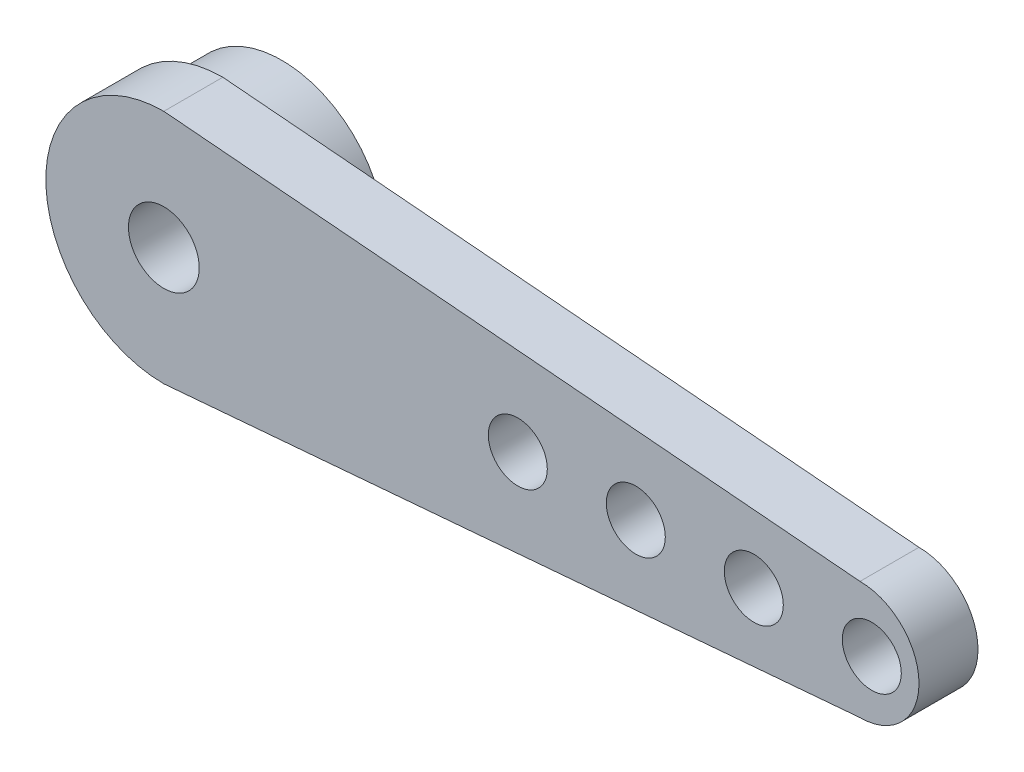
ISO-10303-21;
HEADER;
FILE_DESCRIPTION(('STEP AP214'),'2;1');
FILE_NAME('part.step','',(''),(''),'','','');
FILE_SCHEMA(('AUTOMOTIVE_DESIGN { 1 0 10303 214 1 1 1 1 }'));
ENDSEC;
DATA;
#1=APPLICATION_CONTEXT('core data for automotive mechanical design processes');
#2=APPLICATION_PROTOCOL_DEFINITION('international standard','automotive_design',2000,#1);
#3=PRODUCT_CONTEXT('',#1,'mechanical');
#4=PRODUCT('Part','Part','',(#3));
#5=PRODUCT_RELATED_PRODUCT_CATEGORY('part','',(#4));
#6=PRODUCT_DEFINITION_FORMATION('','',#4);
#7=PRODUCT_DEFINITION_CONTEXT('part definition',#1,'design');
#8=PRODUCT_DEFINITION('design','',#6,#7);
#9=PRODUCT_DEFINITION_SHAPE('','',#8);
#10=(LENGTH_UNIT() NAMED_UNIT(*) SI_UNIT(.MILLI.,.METRE.));
#11=(NAMED_UNIT(*) PLANE_ANGLE_UNIT() SI_UNIT($,.RADIAN.));
#12=(NAMED_UNIT(*) SI_UNIT($,.STERADIAN.) SOLID_ANGLE_UNIT());
#13=UNCERTAINTY_MEASURE_WITH_UNIT(LENGTH_MEASURE(1.E-05),#10,'distance_accuracy_value','');
#14=(GEOMETRIC_REPRESENTATION_CONTEXT(3) GLOBAL_UNCERTAINTY_ASSIGNED_CONTEXT((#13)) GLOBAL_UNIT_ASSIGNED_CONTEXT((#10,
#11,#12)) REPRESENTATION_CONTEXT('',''));
#15=CARTESIAN_POINT('',(0.,0.,0.));
#16=DIRECTION('',(0.,0.,1.));
#17=DIRECTION('',(1.,0.,0.));
#18=AXIS2_PLACEMENT_3D('',#15,#16,#17);
#19=CARTESIAN_POINT('',(0.,0.,0.));
#20=DIRECTION('',(0.,0.,1.));
#21=DIRECTION('',(1.,0.,0.));
#22=AXIS2_PLACEMENT_3D('',#19,#20,#21);
#23=PLANE('',#22);
#24=CARTESIAN_POINT('',(0.,0.,0.));
#25=DIRECTION('',(0.,0.,1.));
#26=DIRECTION('',(1.,0.,0.));
#27=AXIS2_PLACEMENT_3D('',#24,#25,#26);
#28=CIRCLE('',#27,1.5);
#29=CARTESIAN_POINT('',(1.5,0.,0.));
#30=VERTEX_POINT('',#29);
#31=EDGE_CURVE('E115',#30,#30,#28,.T.);
#32=ORIENTED_EDGE('',*,*,#31,.T.);
#33=EDGE_LOOP('',(#32));
#34=FACE_BOUND('',#33,.T.);
#35=CARTESIAN_POINT('',(0.,0.,0.));
#36=DIRECTION('',(0.,0.,-1.));
#37=DIRECTION('',(-1.,0.,0.));
#38=AXIS2_PLACEMENT_3D('',#35,#36,#37);
#39=CIRCLE('',#38,2.85);
#40=CARTESIAN_POINT('',(-2.85,0.,0.));
#41=VERTEX_POINT('',#40);
#42=EDGE_CURVE('E159',#41,#41,#39,.T.);
#43=ORIENTED_EDGE('',*,*,#42,.T.);
#44=EDGE_LOOP('',(#43));
#45=FACE_BOUND('',#44,.T.);
#46=ADVANCED_FACE('F36',(#34,#45),#23,.F.);
#47=CARTESIAN_POINT('',(0.420707358813463,-4.96434683399886,2.5));
#48=DIRECTION('',(-0.0844430766861806,0.996428304896931,0.));
#49=DIRECTION('',(-0.996428304896931,-0.0844430766861806,0.));
#50=AXIS2_PLACEMENT_3D('',#47,#48,#49);
#51=PLANE('',#50);
#52=DIRECTION('',(0.996428304896931,0.0844430766861806,0.));
#53=VECTOR('',#52,1.);
#54=CARTESIAN_POINT('',(0.420707358813463,-4.96434683399886,0.));
#55=LINE('',#54,#53);
#56=CARTESIAN_POINT('',(0.,-5.,0.));
#57=VERTEX_POINT('',#56);
#58=CARTESIAN_POINT('',(29.5,-2.5,0.));
#59=VERTEX_POINT('',#58);
#60=EDGE_CURVE('E118',#57,#59,#55,.T.);
#61=ORIENTED_EDGE('',*,*,#60,.T.);
#62=DIRECTION('',(0.,0.,-1.));
#63=VECTOR('',#62,1.);
#64=CARTESIAN_POINT('',(29.5,-2.5,2.5));
#65=LINE('',#64,#63);
#66=CARTESIAN_POINT('',(29.5,-2.5,2.5));
#67=VERTEX_POINT('',#66);
#68=EDGE_CURVE('E45',#67,#59,#65,.T.);
#69=ORIENTED_EDGE('',*,*,#68,.F.);
#70=DIRECTION('',(0.996428304896931,0.0844430766861806,0.));
#71=VECTOR('',#70,1.);
#72=CARTESIAN_POINT('',(0.420707358813463,-4.96434683399886,2.5));
#73=LINE('',#72,#71);
#74=CARTESIAN_POINT('',(0.,-5.,2.5));
#75=VERTEX_POINT('',#74);
#76=EDGE_CURVE('E85',#75,#67,#73,.T.);
#77=ORIENTED_EDGE('',*,*,#76,.F.);
#78=DIRECTION('',(0.,0.,-1.));
#79=VECTOR('',#78,1.);
#80=CARTESIAN_POINT('',(0.,-5.,2.5));
#81=LINE('',#80,#79);
#82=EDGE_CURVE('E98',#75,#57,#81,.T.);
#83=ORIENTED_EDGE('',*,*,#82,.T.);
#84=EDGE_LOOP('',(#61,#69,#77,#83));
#85=FACE_BOUND('',#84,.T.);
#86=ADVANCED_FACE('F129',(#85),#51,.F.);
#87=CARTESIAN_POINT('',(29.5,0.,2.5));
#88=DIRECTION('',(0.,0.,-1.));
#89=DIRECTION('',(-1.,0.,0.));
#90=AXIS2_PLACEMENT_3D('',#87,#88,#89);
#91=CYLINDRICAL_SURFACE('',#90,2.5);
#92=CARTESIAN_POINT('',(29.5,0.,0.));
#93=DIRECTION('',(0.,0.,1.));
#94=DIRECTION('',(1.,0.,0.));
#95=AXIS2_PLACEMENT_3D('',#92,#93,#94);
#96=CIRCLE('',#95,2.5);
#97=CARTESIAN_POINT('',(29.5,2.5,0.));
#98=VERTEX_POINT('',#97);
#99=EDGE_CURVE('E91',#59,#98,#96,.T.);
#100=ORIENTED_EDGE('',*,*,#99,.T.);
#101=DIRECTION('',(0.,0.,-1.));
#102=VECTOR('',#101,1.);
#103=CARTESIAN_POINT('',(29.5,2.5,2.5));
#104=LINE('',#103,#102);
#105=CARTESIAN_POINT('',(29.5,2.5,2.5));
#106=VERTEX_POINT('',#105);
#107=EDGE_CURVE('E89',#106,#98,#104,.T.);
#108=ORIENTED_EDGE('',*,*,#107,.F.);
#109=CARTESIAN_POINT('',(29.5,0.,2.5));
#110=DIRECTION('',(0.,0.,1.));
#111=DIRECTION('',(1.,0.,0.));
#112=AXIS2_PLACEMENT_3D('',#109,#110,#111);
#113=CIRCLE('',#112,2.5);
#114=EDGE_CURVE('E80',#67,#106,#113,.T.);
#115=ORIENTED_EDGE('',*,*,#114,.F.);
#116=ORIENTED_EDGE('',*,*,#68,.T.);
#117=EDGE_LOOP('',(#100,#108,#115,#116));
#118=FACE_BOUND('',#117,.T.);
#119=ADVANCED_FACE('F90',(#118),#91,.T.);
#120=CARTESIAN_POINT('',(0.420707358813463,4.96434683399886,2.5));
#121=DIRECTION('',(0.0844430766861806,0.996428304896931,0.));
#122=DIRECTION('',(-0.996428304896931,0.0844430766861806,0.));
#123=AXIS2_PLACEMENT_3D('',#120,#121,#122);
#124=PLANE('',#123);
#125=DIRECTION('',(0.996428304896931,-0.0844430766861806,0.));
#126=VECTOR('',#125,1.);
#127=CARTESIAN_POINT('',(0.420707358813463,4.96434683399886,0.));
#128=LINE('',#127,#126);
#129=CARTESIAN_POINT('',(0.,5.,0.));
#130=VERTEX_POINT('',#129);
#131=EDGE_CURVE('E122',#130,#98,#128,.T.);
#132=ORIENTED_EDGE('',*,*,#131,.F.);
#133=DIRECTION('',(0.,0.,-1.));
#134=VECTOR('',#133,1.);
#135=CARTESIAN_POINT('',(0.,5.,2.5));
#136=LINE('',#135,#134);
#137=CARTESIAN_POINT('',(0.,5.,2.5));
#138=VERTEX_POINT('',#137);
#139=EDGE_CURVE('E69',#138,#130,#136,.T.);
#140=ORIENTED_EDGE('',*,*,#139,.F.);
#141=DIRECTION('',(0.996428304896931,-0.0844430766861806,0.));
#142=VECTOR('',#141,1.);
#143=CARTESIAN_POINT('',(0.420707358813463,4.96434683399886,2.5));
#144=LINE('',#143,#142);
#145=EDGE_CURVE('E83',#138,#106,#144,.T.);
#146=ORIENTED_EDGE('',*,*,#145,.T.);
#147=ORIENTED_EDGE('',*,*,#107,.T.);
#148=EDGE_LOOP('',(#132,#140,#146,#147));
#149=FACE_BOUND('',#148,.T.);
#150=ADVANCED_FACE('F96',(#149),#124,.T.);
#151=CARTESIAN_POINT('',(0.,0.,2.5));
#152=DIRECTION('',(0.,0.,-1.));
#153=DIRECTION('',(-1.,0.,0.));
#154=AXIS2_PLACEMENT_3D('',#151,#152,#153);
#155=CYLINDRICAL_SURFACE('',#154,1.5);
#156=CARTESIAN_POINT('',(0.,0.,2.5));
#157=DIRECTION('',(0.,0.,1.));
#158=DIRECTION('',(1.,0.,0.));
#159=AXIS2_PLACEMENT_3D('',#156,#157,#158);
#160=CIRCLE('',#159,1.5);
#161=CARTESIAN_POINT('',(1.5,0.,2.5));
#162=VERTEX_POINT('',#161);
#163=EDGE_CURVE('E179',#162,#162,#160,.T.);
#164=ORIENTED_EDGE('',*,*,#163,.T.);
#165=EDGE_LOOP('',(#164));
#166=FACE_BOUND('',#165,.T.);
#167=ORIENTED_EDGE('',*,*,#31,.F.);
#168=EDGE_LOOP('',(#167));
#169=FACE_BOUND('',#168,.T.);
#170=ADVANCED_FACE('F183',(#166,#169),#155,.F.);
#171=CARTESIAN_POINT('',(15.,0.,2.5));
#172=DIRECTION('',(0.,0.,-1.));
#173=DIRECTION('',(-1.,0.,0.));
#174=AXIS2_PLACEMENT_3D('',#171,#172,#173);
#175=CYLINDRICAL_SURFACE('',#174,1.25);
#176=CARTESIAN_POINT('',(15.,0.,2.5));
#177=DIRECTION('',(0.,0.,1.));
#178=DIRECTION('',(1.,0.,0.));
#179=AXIS2_PLACEMENT_3D('',#176,#177,#178);
#180=CIRCLE('',#179,1.25);
#181=CARTESIAN_POINT('',(16.25,0.,2.5));
#182=VERTEX_POINT('',#181);
#183=EDGE_CURVE('E176',#182,#182,#180,.T.);
#184=ORIENTED_EDGE('',*,*,#183,.T.);
#185=EDGE_LOOP('',(#184));
#186=FACE_BOUND('',#185,.T.);
#187=CARTESIAN_POINT('',(15.,0.,0.));
#188=DIRECTION('',(0.,0.,1.));
#189=DIRECTION('',(1.,0.,0.));
#190=AXIS2_PLACEMENT_3D('',#187,#188,#189);
#191=CIRCLE('',#190,1.25);
#192=CARTESIAN_POINT('',(16.25,0.,0.));
#193=VERTEX_POINT('',#192);
#194=EDGE_CURVE('E112',#193,#193,#191,.T.);
#195=ORIENTED_EDGE('',*,*,#194,.F.);
#196=EDGE_LOOP('',(#195));
#197=FACE_BOUND('',#196,.T.);
#198=ADVANCED_FACE('F187',(#186,#197),#175,.F.);
#199=CARTESIAN_POINT('',(20.,0.,2.5));
#200=DIRECTION('',(0.,0.,-1.));
#201=DIRECTION('',(-1.,0.,0.));
#202=AXIS2_PLACEMENT_3D('',#199,#200,#201);
#203=CYLINDRICAL_SURFACE('',#202,1.25);
#204=CARTESIAN_POINT('',(20.,0.,2.5));
#205=DIRECTION('',(0.,0.,1.));
#206=DIRECTION('',(1.,0.,0.));
#207=AXIS2_PLACEMENT_3D('',#204,#205,#206);
#208=CIRCLE('',#207,1.25);
#209=CARTESIAN_POINT('',(21.25,0.,2.5));
#210=VERTEX_POINT('',#209);
#211=EDGE_CURVE('E173',#210,#210,#208,.T.);
#212=ORIENTED_EDGE('',*,*,#211,.T.);
#213=EDGE_LOOP('',(#212));
#214=FACE_BOUND('',#213,.T.);
#215=CARTESIAN_POINT('',(20.,0.,0.));
#216=DIRECTION('',(0.,0.,1.));
#217=DIRECTION('',(1.,0.,0.));
#218=AXIS2_PLACEMENT_3D('',#215,#216,#217);
#219=CIRCLE('',#218,1.25);
#220=CARTESIAN_POINT('',(21.25,0.,0.));
#221=VERTEX_POINT('',#220);
#222=EDGE_CURVE('E109',#221,#221,#219,.T.);
#223=ORIENTED_EDGE('',*,*,#222,.F.);
#224=EDGE_LOOP('',(#223));
#225=FACE_BOUND('',#224,.T.);
#226=ADVANCED_FACE('F193',(#214,#225),#203,.F.);
#227=CARTESIAN_POINT('',(25.,0.,2.5));
#228=DIRECTION('',(0.,0.,-1.));
#229=DIRECTION('',(-1.,0.,0.));
#230=AXIS2_PLACEMENT_3D('',#227,#228,#229);
#231=CYLINDRICAL_SURFACE('',#230,1.25);
#232=CARTESIAN_POINT('',(25.,0.,2.5));
#233=DIRECTION('',(0.,0.,1.));
#234=DIRECTION('',(1.,0.,0.));
#235=AXIS2_PLACEMENT_3D('',#232,#233,#234);
#236=CIRCLE('',#235,1.25);
#237=CARTESIAN_POINT('',(26.25,0.,2.5));
#238=VERTEX_POINT('',#237);
#239=EDGE_CURVE('E170',#238,#238,#236,.T.);
#240=ORIENTED_EDGE('',*,*,#239,.T.);
#241=EDGE_LOOP('',(#240));
#242=FACE_BOUND('',#241,.T.);
#243=CARTESIAN_POINT('',(25.,0.,0.));
#244=DIRECTION('',(0.,0.,1.));
#245=DIRECTION('',(1.,0.,0.));
#246=AXIS2_PLACEMENT_3D('',#243,#244,#245);
#247=CIRCLE('',#246,1.25);
#248=CARTESIAN_POINT('',(26.25,0.,0.));
#249=VERTEX_POINT('',#248);
#250=EDGE_CURVE('E105',#249,#249,#247,.T.);
#251=ORIENTED_EDGE('',*,*,#250,.F.);
#252=EDGE_LOOP('',(#251));
#253=FACE_BOUND('',#252,.T.);
#254=ADVANCED_FACE('F200',(#242,#253),#231,.F.);
#255=CARTESIAN_POINT('',(30.,0.,2.5));
#256=DIRECTION('',(0.,0.,-1.));
#257=DIRECTION('',(-1.,0.,0.));
#258=AXIS2_PLACEMENT_3D('',#255,#256,#257);
#259=CYLINDRICAL_SURFACE('',#258,1.25);
#260=CARTESIAN_POINT('',(30.,0.,2.5));
#261=DIRECTION('',(0.,0.,1.));
#262=DIRECTION('',(1.,0.,0.));
#263=AXIS2_PLACEMENT_3D('',#260,#261,#262);
#264=CIRCLE('',#263,1.25);
#265=CARTESIAN_POINT('',(31.25,0.,2.5));
#266=VERTEX_POINT('',#265);
#267=EDGE_CURVE('E125',#266,#266,#264,.T.);
#268=ORIENTED_EDGE('',*,*,#267,.T.);
#269=EDGE_LOOP('',(#268));
#270=FACE_BOUND('',#269,.T.);
#271=CARTESIAN_POINT('',(30.,0.,0.));
#272=DIRECTION('',(0.,0.,1.));
#273=DIRECTION('',(1.,0.,0.));
#274=AXIS2_PLACEMENT_3D('',#271,#272,#273);
#275=CIRCLE('',#274,1.25);
#276=CARTESIAN_POINT('',(31.25,0.,0.));
#277=VERTEX_POINT('',#276);
#278=EDGE_CURVE('E102',#277,#277,#275,.T.);
#279=ORIENTED_EDGE('',*,*,#278,.F.);
#280=EDGE_LOOP('',(#279));
#281=FACE_BOUND('',#280,.T.);
#282=ADVANCED_FACE('F38',(#270,#281),#259,.F.);
#283=CARTESIAN_POINT('',(0.,0.,2.5));
#284=DIRECTION('',(0.,0.,-1.));
#285=DIRECTION('',(-1.,0.,0.));
#286=AXIS2_PLACEMENT_3D('',#283,#284,#285);
#287=CYLINDRICAL_SURFACE('',#286,5.);
#288=CARTESIAN_POINT('',(0.,0.,0.));
#289=DIRECTION('',(0.,0.,1.));
#290=DIRECTION('',(1.,0.,0.));
#291=AXIS2_PLACEMENT_3D('',#288,#289,#290);
#292=CIRCLE('',#291,5.);
#293=EDGE_CURVE('E72',#130,#57,#292,.T.);
#294=ORIENTED_EDGE('',*,*,#293,.T.);
#295=ORIENTED_EDGE('',*,*,#82,.F.);
#296=CARTESIAN_POINT('',(0.,0.,2.5));
#297=DIRECTION('',(0.,0.,1.));
#298=DIRECTION('',(1.,0.,0.));
#299=AXIS2_PLACEMENT_3D('',#296,#297,#298);
#300=CIRCLE('',#299,5.);
#301=EDGE_CURVE('E53',#138,#75,#300,.T.);
#302=ORIENTED_EDGE('',*,*,#301,.F.);
#303=ORIENTED_EDGE('',*,*,#139,.T.);
#304=EDGE_LOOP('',(#294,#295,#302,#303));
#305=FACE_BOUND('',#304,.T.);
#306=ADVANCED_FACE('F143',(#305),#287,.T.);
#307=CARTESIAN_POINT('',(0.,0.,2.5));
#308=DIRECTION('',(0.,0.,1.));
#309=DIRECTION('',(1.,0.,0.));
#310=AXIS2_PLACEMENT_3D('',#307,#308,#309);
#311=PLANE('',#310);
#312=ORIENTED_EDGE('',*,*,#267,.F.);
#313=EDGE_LOOP('',(#312));
#314=FACE_BOUND('',#313,.T.);
#315=ORIENTED_EDGE('',*,*,#239,.F.);
#316=EDGE_LOOP('',(#315));
#317=FACE_BOUND('',#316,.T.);
#318=ORIENTED_EDGE('',*,*,#211,.F.);
#319=EDGE_LOOP('',(#318));
#320=FACE_BOUND('',#319,.T.);
#321=ORIENTED_EDGE('',*,*,#183,.F.);
#322=EDGE_LOOP('',(#321));
#323=FACE_BOUND('',#322,.T.);
#324=ORIENTED_EDGE('',*,*,#163,.F.);
#325=EDGE_LOOP('',(#324));
#326=FACE_BOUND('',#325,.T.);
#327=ORIENTED_EDGE('',*,*,#76,.T.);
#328=ORIENTED_EDGE('',*,*,#114,.T.);
#329=ORIENTED_EDGE('',*,*,#145,.F.);
#330=ORIENTED_EDGE('',*,*,#301,.T.);
#331=EDGE_LOOP('',(#327,#328,#329,#330));
#332=FACE_BOUND('',#331,.T.);
#333=ADVANCED_FACE('F81',(#314,#317,#320,#323,#326,#332),#311,.T.);
#334=CARTESIAN_POINT('',(0.,0.,0.));
#335=DIRECTION('',(0.,0.,1.));
#336=DIRECTION('',(1.,0.,0.));
#337=AXIS2_PLACEMENT_3D('',#334,#335,#336);
#338=CIRCLE('',#337,4.375);
#339=CARTESIAN_POINT('',(4.375,0.,0.));
#340=VERTEX_POINT('',#339);
#341=EDGE_CURVE('E11',#340,#340,#338,.F.);
#342=ORIENTED_EDGE('',*,*,#341,.F.);
#343=EDGE_LOOP('',(#342));
#344=FACE_BOUND('',#343,.T.);
#345=ORIENTED_EDGE('',*,*,#278,.T.);
#346=EDGE_LOOP('',(#345));
#347=FACE_BOUND('',#346,.T.);
#348=ORIENTED_EDGE('',*,*,#250,.T.);
#349=EDGE_LOOP('',(#348));
#350=FACE_BOUND('',#349,.T.);
#351=ORIENTED_EDGE('',*,*,#222,.T.);
#352=EDGE_LOOP('',(#351));
#353=FACE_BOUND('',#352,.T.);
#354=ORIENTED_EDGE('',*,*,#194,.T.);
#355=EDGE_LOOP('',(#354));
#356=FACE_BOUND('',#355,.T.);
#357=ORIENTED_EDGE('',*,*,#60,.F.);
#358=ORIENTED_EDGE('',*,*,#293,.F.);
#359=ORIENTED_EDGE('',*,*,#131,.T.);
#360=ORIENTED_EDGE('',*,*,#99,.F.);
#361=EDGE_LOOP('',(#357,#358,#359,#360));
#362=FACE_BOUND('',#361,.T.);
#363=ADVANCED_FACE('F131',(#344,#347,#350,#353,#356,#362),#23,.F.);
#364=CARTESIAN_POINT('',(0.,0.,-2.5));
#365=DIRECTION('',(0.,0.,-1.));
#366=DIRECTION('',(-1.,0.,0.));
#367=AXIS2_PLACEMENT_3D('',#364,#365,#366);
#368=PLANE('',#367);
#369=CARTESIAN_POINT('',(0.,0.,-2.5));
#370=DIRECTION('',(0.,0.,-1.));
#371=DIRECTION('',(-1.,0.,0.));
#372=AXIS2_PLACEMENT_3D('',#369,#370,#371);
#373=CIRCLE('',#372,4.375);
#374=CARTESIAN_POINT('',(-4.375,0.,-2.5));
#375=VERTEX_POINT('',#374);
#376=EDGE_CURVE('E106',#375,#375,#373,.T.);
#377=ORIENTED_EDGE('',*,*,#376,.T.);
#378=EDGE_LOOP('',(#377));
#379=FACE_BOUND('',#378,.T.);
#380=CARTESIAN_POINT('',(0.,0.,-2.5));
#381=DIRECTION('',(0.,0.,-1.));
#382=DIRECTION('',(-1.,0.,0.));
#383=AXIS2_PLACEMENT_3D('',#380,#381,#382);
#384=CIRCLE('',#383,2.85);
#385=CARTESIAN_POINT('',(-2.85,0.,-2.5));
#386=VERTEX_POINT('',#385);
#387=EDGE_CURVE('E161',#386,#386,#384,.T.);
#388=ORIENTED_EDGE('',*,*,#387,.F.);
#389=EDGE_LOOP('',(#388));
#390=FACE_BOUND('',#389,.T.);
#391=ADVANCED_FACE('F133',(#379,#390),#368,.T.);
#392=CARTESIAN_POINT('',(0.,0.,-2.5));
#393=DIRECTION('',(0.,0.,1.));
#394=DIRECTION('',(1.,0.,0.));
#395=AXIS2_PLACEMENT_3D('',#392,#393,#394);
#396=CYLINDRICAL_SURFACE('',#395,4.375);
#397=ORIENTED_EDGE('',*,*,#376,.F.);
#398=EDGE_LOOP('',(#397));
#399=FACE_BOUND('',#398,.T.);
#400=ORIENTED_EDGE('',*,*,#341,.T.);
#401=EDGE_LOOP('',(#400));
#402=FACE_BOUND('',#401,.T.);
#403=ADVANCED_FACE('F140',(#399,#402),#396,.T.);
#404=CARTESIAN_POINT('',(0.,0.,-2.5));
#405=DIRECTION('',(0.,0.,1.));
#406=DIRECTION('',(1.,0.,0.));
#407=AXIS2_PLACEMENT_3D('',#404,#405,#406);
#408=CYLINDRICAL_SURFACE('',#407,2.85);
#409=ORIENTED_EDGE('',*,*,#387,.T.);
#410=EDGE_LOOP('',(#409));
#411=FACE_BOUND('',#410,.T.);
#412=ORIENTED_EDGE('',*,*,#42,.F.);
#413=EDGE_LOOP('',(#412));
#414=FACE_BOUND('',#413,.T.);
#415=ADVANCED_FACE('F297',(#411,#414),#408,.F.);
#416=CLOSED_SHELL('',(#46,#86,#119,#150,#170,#198,#226,#254,#282,#306,#333,#363,#391,#403,#415));
#417=MANIFOLD_SOLID_BREP('B2',#416);
#418=ADVANCED_BREP_SHAPE_REPRESENTATION('',(#18,#417),#14);
#419=SHAPE_DEFINITION_REPRESENTATION(#9,#418);
ENDSEC;
END-ISO-10303-21;
